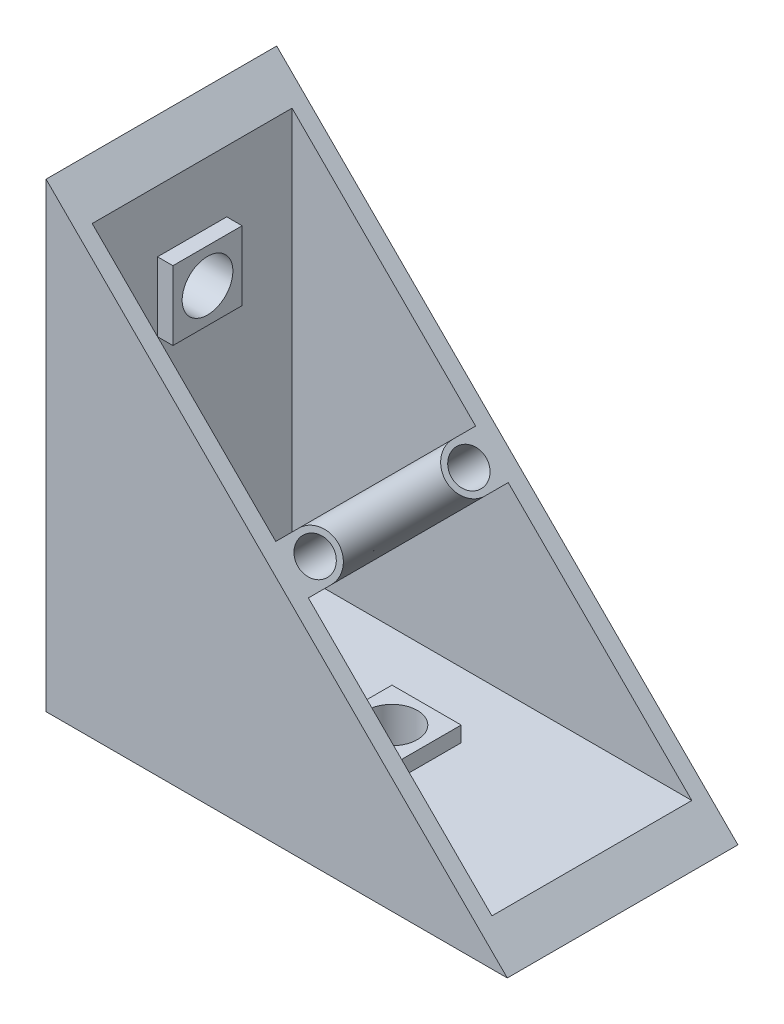
ISO-10303-21;
HEADER;
FILE_DESCRIPTION(('STEP AP214'),'2;1');
FILE_NAME('part.step','',(''),(''),'','','');
FILE_SCHEMA(('AUTOMOTIVE_DESIGN { 1 0 10303 214 1 1 1 1 }'));
ENDSEC;
DATA;
#1=APPLICATION_CONTEXT('core data for automotive mechanical design processes');
#2=APPLICATION_PROTOCOL_DEFINITION('international standard','automotive_design',2000,#1);
#3=PRODUCT_CONTEXT('',#1,'mechanical');
#4=PRODUCT('Part','Part','',(#3));
#5=PRODUCT_RELATED_PRODUCT_CATEGORY('part','',(#4));
#6=PRODUCT_DEFINITION_FORMATION('','',#4);
#7=PRODUCT_DEFINITION_CONTEXT('part definition',#1,'design');
#8=PRODUCT_DEFINITION('design','',#6,#7);
#9=PRODUCT_DEFINITION_SHAPE('','',#8);
#10=(LENGTH_UNIT() NAMED_UNIT(*) SI_UNIT(.MILLI.,.METRE.));
#11=(NAMED_UNIT(*) PLANE_ANGLE_UNIT() SI_UNIT($,.RADIAN.));
#12=(NAMED_UNIT(*) SI_UNIT($,.STERADIAN.) SOLID_ANGLE_UNIT());
#13=UNCERTAINTY_MEASURE_WITH_UNIT(LENGTH_MEASURE(1.E-05),#10,'distance_accuracy_value','');
#14=(GEOMETRIC_REPRESENTATION_CONTEXT(3) GLOBAL_UNCERTAINTY_ASSIGNED_CONTEXT((#13)) GLOBAL_UNIT_ASSIGNED_CONTEXT((#10,
#11,#12)) REPRESENTATION_CONTEXT('',''));
#15=CARTESIAN_POINT('',(0.,0.,0.));
#16=DIRECTION('',(0.,0.,1.));
#17=DIRECTION('',(1.,0.,0.));
#18=AXIS2_PLACEMENT_3D('',#15,#16,#17);
#19=CARTESIAN_POINT('',(4.,0.,-30.));
#20=DIRECTION('',(-1.,0.,0.));
#21=DIRECTION('',(0.,0.,1.));
#22=AXIS2_PLACEMENT_3D('',#19,#20,#21);
#23=PLANE('',#22);
#24=DIRECTION('',(0.,1.,0.));
#25=VECTOR('',#24,1.);
#26=CARTESIAN_POINT('',(4.,48.,-19.5));
#27=LINE('',#26,#25);
#28=CARTESIAN_POINT('',(4.,39.,-19.5));
#29=VERTEX_POINT('',#28);
#30=CARTESIAN_POINT('',(4.,48.,-19.5));
#31=VERTEX_POINT('',#30);
#32=EDGE_CURVE('E273',#29,#31,#27,.T.);
#33=ORIENTED_EDGE('',*,*,#32,.F.);
#34=DIRECTION('',(0.,0.,-1.));
#35=VECTOR('',#34,1.);
#36=CARTESIAN_POINT('',(4.,39.,-10.5));
#37=LINE('',#36,#35);
#38=CARTESIAN_POINT('',(4.,39.,-10.5));
#39=VERTEX_POINT('',#38);
#40=EDGE_CURVE('E278',#39,#29,#37,.T.);
#41=ORIENTED_EDGE('',*,*,#40,.F.);
#42=DIRECTION('',(0.,-1.,0.));
#43=VECTOR('',#42,1.);
#44=CARTESIAN_POINT('',(4.,48.,-10.5));
#45=LINE('',#44,#43);
#46=CARTESIAN_POINT('',(4.,48.,-10.5));
#47=VERTEX_POINT('',#46);
#48=EDGE_CURVE('E290',#47,#39,#45,.T.);
#49=ORIENTED_EDGE('',*,*,#48,.F.);
#50=DIRECTION('',(0.,0.,1.));
#51=VECTOR('',#50,1.);
#52=CARTESIAN_POINT('',(4.,48.,-10.5));
#53=LINE('',#52,#51);
#54=EDGE_CURVE('E287',#31,#47,#53,.T.);
#55=ORIENTED_EDGE('',*,*,#54,.F.);
#56=EDGE_LOOP('',(#33,#41,#49,#55));
#57=FACE_BOUND('',#56,.T.);
#58=DIRECTION('',(0.,-1.,0.));
#59=VECTOR('',#58,1.);
#60=CARTESIAN_POINT('',(4.,0.,-2.));
#61=LINE('',#60,#59);
#62=CARTESIAN_POINT('',(4.,56.,-2.));
#63=VERTEX_POINT('',#62);
#64=CARTESIAN_POINT('',(4.,8.24264068711929,-2.));
#65=VERTEX_POINT('',#64);
#66=EDGE_CURVE('E339',#63,#65,#61,.T.);
#67=ORIENTED_EDGE('',*,*,#66,.T.);
#68=DIRECTION('',(0.,0.,-1.));
#69=VECTOR('',#68,1.);
#70=CARTESIAN_POINT('',(4.,8.24264068711932,-30.));
#71=LINE('',#70,#69);
#72=CARTESIAN_POINT('',(4.,8.24264068711929,-5.));
#73=VERTEX_POINT('',#72);
#74=EDGE_CURVE('E238',#65,#73,#71,.T.);
#75=ORIENTED_EDGE('',*,*,#74,.T.);
#76=CARTESIAN_POINT('',(4.,4.00000000000001,-5.));
#77=DIRECTION('',(-1.,0.,0.));
#78=DIRECTION('',(0.,1.,0.));
#79=AXIS2_PLACEMENT_3D('',#76,#77,#78);
#80=ELLIPSE('',#79,4.24264068711928,3.);
#81=CARTESIAN_POINT('',(4.00000000000001,4.,-8.));
#82=VERTEX_POINT('',#81);
#83=EDGE_CURVE('E267',#73,#82,#80,.T.);
#84=ORIENTED_EDGE('',*,*,#83,.T.);
#85=DIRECTION('',(0.,0.,1.));
#86=VECTOR('',#85,1.);
#87=CARTESIAN_POINT('',(4.,4.,-30.));
#88=LINE('',#87,#86);
#89=CARTESIAN_POINT('',(4.,4.,-22.));
#90=VERTEX_POINT('',#89);
#91=EDGE_CURVE('E349',#90,#82,#88,.T.);
#92=ORIENTED_EDGE('',*,*,#91,.F.);
#93=CARTESIAN_POINT('',(4.,3.99999999999999,-25.));
#94=DIRECTION('',(-1.,0.,0.));
#95=DIRECTION('',(0.,1.,0.));
#96=AXIS2_PLACEMENT_3D('',#93,#94,#95);
#97=ELLIPSE('',#96,4.24264068711928,3.);
#98=CARTESIAN_POINT('',(4.,8.24264068711928,-25.));
#99=VERTEX_POINT('',#98);
#100=EDGE_CURVE('E60',#99,#90,#97,.F.);
#101=ORIENTED_EDGE('',*,*,#100,.F.);
#102=DIRECTION('',(0.,0.,1.));
#103=VECTOR('',#102,1.);
#104=CARTESIAN_POINT('',(4.,8.24264068711926,-30.));
#105=LINE('',#104,#103);
#106=CARTESIAN_POINT('',(4.,8.24264068711927,-28.));
#107=VERTEX_POINT('',#106);
#108=EDGE_CURVE('E261',#107,#99,#105,.T.);
#109=ORIENTED_EDGE('',*,*,#108,.F.);
#110=DIRECTION('',(0.,-1.,0.));
#111=VECTOR('',#110,1.);
#112=CARTESIAN_POINT('',(4.,0.,-28.));
#113=LINE('',#112,#111);
#114=CARTESIAN_POINT('',(4.,56.,-28.));
#115=VERTEX_POINT('',#114);
#116=EDGE_CURVE('E343',#115,#107,#113,.T.);
#117=ORIENTED_EDGE('',*,*,#116,.F.);
#118=DIRECTION('',(0.,0.,1.));
#119=VECTOR('',#118,1.);
#120=CARTESIAN_POINT('',(4.,56.,-30.));
#121=LINE('',#120,#119);
#122=EDGE_CURVE('E356',#115,#63,#121,.T.);
#123=ORIENTED_EDGE('',*,*,#122,.T.);
#124=EDGE_LOOP('',(#67,#75,#84,#92,#101,#109,#117,#123));
#125=FACE_BOUND('',#124,.T.);
#126=ADVANCED_FACE('F45',(#57,#125),#23,.F.);
#127=CARTESIAN_POINT('',(0.,4.,-30.));
#128=DIRECTION('',(0.,-1.,0.));
#129=DIRECTION('',(0.,0.,-1.));
#130=AXIS2_PLACEMENT_3D('',#127,#128,#129);
#131=PLANE('',#130);
#132=DIRECTION('',(0.,0.,-1.));
#133=VECTOR('',#132,1.);
#134=CARTESIAN_POINT('',(34.5,4.,-19.5));
#135=LINE('',#134,#133);
#136=CARTESIAN_POINT('',(34.5,4.,-10.5));
#137=VERTEX_POINT('',#136);
#138=CARTESIAN_POINT('',(34.5,4.,-19.5));
#139=VERTEX_POINT('',#138);
#140=EDGE_CURVE('E306',#137,#139,#135,.T.);
#141=ORIENTED_EDGE('',*,*,#140,.F.);
#142=DIRECTION('',(1.,0.,0.));
#143=VECTOR('',#142,1.);
#144=CARTESIAN_POINT('',(25.5,4.,-10.5));
#145=LINE('',#144,#143);
#146=CARTESIAN_POINT('',(25.5,4.,-10.5));
#147=VERTEX_POINT('',#146);
#148=EDGE_CURVE('E311',#147,#137,#145,.T.);
#149=ORIENTED_EDGE('',*,*,#148,.F.);
#150=DIRECTION('',(0.,0.,1.));
#151=VECTOR('',#150,1.);
#152=CARTESIAN_POINT('',(25.5,4.,-19.5));
#153=LINE('',#152,#151);
#154=CARTESIAN_POINT('',(25.5,4.,-19.5));
#155=VERTEX_POINT('',#154);
#156=EDGE_CURVE('E323',#155,#147,#153,.T.);
#157=ORIENTED_EDGE('',*,*,#156,.F.);
#158=DIRECTION('',(-1.,0.,0.));
#159=VECTOR('',#158,1.);
#160=CARTESIAN_POINT('',(25.5,4.,-19.5));
#161=LINE('',#160,#159);
#162=EDGE_CURVE('E320',#139,#155,#161,.T.);
#163=ORIENTED_EDGE('',*,*,#162,.F.);
#164=EDGE_LOOP('',(#141,#149,#157,#163));
#165=FACE_BOUND('',#164,.T.);
#166=DIRECTION('',(0.,0.,-1.));
#167=VECTOR('',#166,1.);
#168=CARTESIAN_POINT('',(8.24264068711924,4.,-30.));
#169=LINE('',#168,#167);
#170=CARTESIAN_POINT('',(8.24264068711927,4.,-2.));
#171=VERTEX_POINT('',#170);
#172=CARTESIAN_POINT('',(8.24264068711927,4.,-5.));
#173=VERTEX_POINT('',#172);
#174=EDGE_CURVE('E213',#171,#173,#169,.T.);
#175=ORIENTED_EDGE('',*,*,#174,.F.);
#176=DIRECTION('',(1.,0.,0.));
#177=VECTOR('',#176,1.);
#178=CARTESIAN_POINT('',(0.,4.,-2.));
#179=LINE('',#178,#177);
#180=CARTESIAN_POINT('',(56.,4.,-2.));
#181=VERTEX_POINT('',#180);
#182=EDGE_CURVE('E342',#171,#181,#179,.T.);
#183=ORIENTED_EDGE('',*,*,#182,.T.);
#184=DIRECTION('',(0.,0.,1.));
#185=VECTOR('',#184,1.);
#186=CARTESIAN_POINT('',(56.,4.,-30.));
#187=LINE('',#186,#185);
#188=CARTESIAN_POINT('',(56.,4.,-28.));
#189=VERTEX_POINT('',#188);
#190=EDGE_CURVE('E360',#189,#181,#187,.T.);
#191=ORIENTED_EDGE('',*,*,#190,.F.);
#192=DIRECTION('',(1.,0.,0.));
#193=VECTOR('',#192,1.);
#194=CARTESIAN_POINT('',(0.,4.,-28.));
#195=LINE('',#194,#193);
#196=CARTESIAN_POINT('',(8.24264068711929,4.,-28.));
#197=VERTEX_POINT('',#196);
#198=EDGE_CURVE('E346',#197,#189,#195,.T.);
#199=ORIENTED_EDGE('',*,*,#198,.F.);
#200=DIRECTION('',(0.,0.,1.));
#201=VECTOR('',#200,1.);
#202=CARTESIAN_POINT('',(8.24264068711929,4.,-30.));
#203=LINE('',#202,#201);
#204=CARTESIAN_POINT('',(8.24264068711929,4.,-25.));
#205=VERTEX_POINT('',#204);
#206=EDGE_CURVE('E68',#197,#205,#203,.T.);
#207=ORIENTED_EDGE('',*,*,#206,.T.);
#208=CARTESIAN_POINT('',(4.00000000000001,4.,-25.));
#209=DIRECTION('',(0.,-1.,0.));
#210=DIRECTION('',(1.,0.,0.));
#211=AXIS2_PLACEMENT_3D('',#208,#209,#210);
#212=ELLIPSE('',#211,4.24264068711929,3.);
#213=EDGE_CURVE('E400',#90,#205,#212,.F.);
#214=ORIENTED_EDGE('',*,*,#213,.F.);
#215=ORIENTED_EDGE('',*,*,#91,.T.);
#216=CARTESIAN_POINT('',(3.99999999999999,4.,-5.));
#217=DIRECTION('',(0.,-1.,0.));
#218=DIRECTION('',(1.,0.,0.));
#219=AXIS2_PLACEMENT_3D('',#216,#217,#218);
#220=ELLIPSE('',#219,4.24264068711929,3.);
#221=EDGE_CURVE('E53',#82,#173,#220,.T.);
#222=ORIENTED_EDGE('',*,*,#221,.T.);
#223=EDGE_LOOP('',(#175,#183,#191,#199,#207,#214,#215,#222));
#224=FACE_BOUND('',#223,.T.);
#225=ADVANCED_FACE('F402',(#165,#224),#131,.F.);
#226=CARTESIAN_POINT('',(0.,0.,-28.));
#227=DIRECTION('',(0.,0.,-1.));
#228=DIRECTION('',(-1.,0.,0.));
#229=AXIS2_PLACEMENT_3D('',#226,#227,#228);
#230=PLANE('',#229);
#231=DIRECTION('',(-0.707106781186548,-0.707106781186547,0.));
#232=VECTOR('',#231,1.);
#233=CARTESIAN_POINT('',(-2.12132034355964,2.12132034355964,-28.));
#234=LINE('',#233,#232);
#235=CARTESIAN_POINT('',(27.8786796564404,32.1213203435596,-28.));
#236=VERTEX_POINT('',#235);
#237=EDGE_CURVE('E394',#236,#107,#234,.T.);
#238=ORIENTED_EDGE('',*,*,#237,.F.);
#239=DIRECTION('',(-0.707106781186548,0.707106781186548,0.));
#240=VECTOR('',#239,1.);
#241=CARTESIAN_POINT('',(0.,60.,-28.));
#242=LINE('',#241,#240);
#243=EDGE_CURVE('E355',#236,#115,#242,.T.);
#244=ORIENTED_EDGE('',*,*,#243,.T.);
#245=ORIENTED_EDGE('',*,*,#116,.T.);
#246=EDGE_LOOP('',(#238,#244,#245));
#247=FACE_BOUND('',#246,.T.);
#248=ADVANCED_FACE('F415',(#247),#230,.F.);
#249=CARTESIAN_POINT('',(0.,0.,-2.));
#250=DIRECTION('',(0.,0.,-1.));
#251=DIRECTION('',(-1.,0.,0.));
#252=AXIS2_PLACEMENT_3D('',#249,#250,#251);
#253=PLANE('',#252);
#254=ORIENTED_EDGE('',*,*,#182,.F.);
#255=DIRECTION('',(0.707106781186548,0.707106781186547,0.));
#256=VECTOR('',#255,1.);
#257=CARTESIAN_POINT('',(2.12132034355963,-2.12132034355964,-2.));
#258=LINE('',#257,#256);
#259=CARTESIAN_POINT('',(32.1213203435597,27.8786796564404,-2.));
#260=VERTEX_POINT('',#259);
#261=EDGE_CURVE('E390',#171,#260,#258,.T.);
#262=ORIENTED_EDGE('',*,*,#261,.T.);
#263=DIRECTION('',(-0.707106781186548,0.707106781186548,0.));
#264=VECTOR('',#263,1.);
#265=CARTESIAN_POINT('',(0.,60.,-2.));
#266=LINE('',#265,#264);
#267=EDGE_CURVE('E228',#181,#260,#266,.T.);
#268=ORIENTED_EDGE('',*,*,#267,.F.);
#269=EDGE_LOOP('',(#254,#262,#268));
#270=FACE_BOUND('',#269,.T.);
#271=ADVANCED_FACE('F433',(#270),#253,.T.);
#272=CARTESIAN_POINT('',(0.,60.,-30.));
#273=DIRECTION('',(0.707106781186547,0.707106781186547,0.));
#274=DIRECTION('',(-0.707106781186548,0.707106781186548,0.));
#275=AXIS2_PLACEMENT_3D('',#272,#273,#274);
#276=PLANE('',#275);
#277=DIRECTION('',(-0.707106781186547,0.707106781186547,0.));
#278=VECTOR('',#277,1.);
#279=CARTESIAN_POINT('',(0.,60.,0.));
#280=LINE('',#279,#278);
#281=CARTESIAN_POINT('',(60.,0.,0.));
#282=VERTEX_POINT('',#281);
#283=CARTESIAN_POINT('',(0.,60.,0.));
#284=VERTEX_POINT('',#283);
#285=EDGE_CURVE('E368',#282,#284,#280,.T.);
#286=ORIENTED_EDGE('',*,*,#285,.F.);
#287=DIRECTION('',(0.,0.,1.));
#288=VECTOR('',#287,1.);
#289=CARTESIAN_POINT('',(60.,0.,-30.));
#290=LINE('',#289,#288);
#291=CARTESIAN_POINT('',(60.,0.,-30.));
#292=VERTEX_POINT('',#291);
#293=EDGE_CURVE('E385',#292,#282,#290,.T.);
#294=ORIENTED_EDGE('',*,*,#293,.F.);
#295=DIRECTION('',(-0.707106781186547,0.707106781186547,0.));
#296=VECTOR('',#295,1.);
#297=CARTESIAN_POINT('',(0.,60.,-30.));
#298=LINE('',#297,#296);
#299=CARTESIAN_POINT('',(0.,60.,-30.));
#300=VERTEX_POINT('',#299);
#301=EDGE_CURVE('E371',#292,#300,#298,.T.);
#302=ORIENTED_EDGE('',*,*,#301,.T.);
#303=DIRECTION('',(0.,0.,1.));
#304=VECTOR('',#303,1.);
#305=CARTESIAN_POINT('',(0.,60.,-30.));
#306=LINE('',#305,#304);
#307=EDGE_CURVE('E382',#300,#284,#306,.T.);
#308=ORIENTED_EDGE('',*,*,#307,.T.);
#309=EDGE_LOOP('',(#286,#294,#302,#308));
#310=FACE_BOUND('',#309,.T.);
#311=ORIENTED_EDGE('',*,*,#190,.T.);
#312=ORIENTED_EDGE('',*,*,#267,.T.);
#313=DIRECTION('',(0.,0.,1.));
#314=VECTOR('',#313,1.);
#315=CARTESIAN_POINT('',(32.1213203435597,27.8786796564404,0.));
#316=LINE('',#315,#314);
#317=CARTESIAN_POINT('',(32.1213203435597,27.8786796564404,-5.));
#318=VERTEX_POINT('',#317);
#319=EDGE_CURVE('E210',#318,#260,#316,.T.);
#320=ORIENTED_EDGE('',*,*,#319,.F.);
#321=CARTESIAN_POINT('',(30.,30.,-5.));
#322=DIRECTION('',(0.707106781186548,0.707106781186547,0.));
#323=DIRECTION('',(-0.707106781186547,0.707106781186548,0.));
#324=AXIS2_PLACEMENT_3D('',#321,#322,#323);
#325=CIRCLE('',#324,3.);
#326=CARTESIAN_POINT('',(27.8786796564404,32.1213203435597,-5.));
#327=VERTEX_POINT('',#326);
#328=EDGE_CURVE('E226',#318,#327,#325,.T.);
#329=ORIENTED_EDGE('',*,*,#328,.T.);
#330=DIRECTION('',(0.,0.,1.));
#331=VECTOR('',#330,1.);
#332=CARTESIAN_POINT('',(27.8786796564404,32.1213203435597,0.));
#333=LINE('',#332,#331);
#334=CARTESIAN_POINT('',(27.8786796564404,32.1213203435596,-2.));
#335=VERTEX_POINT('',#334);
#336=EDGE_CURVE('E218',#327,#335,#333,.T.);
#337=ORIENTED_EDGE('',*,*,#336,.T.);
#338=EDGE_CURVE('E353',#335,#63,#266,.T.);
#339=ORIENTED_EDGE('',*,*,#338,.T.);
#340=ORIENTED_EDGE('',*,*,#122,.F.);
#341=ORIENTED_EDGE('',*,*,#243,.F.);
#342=DIRECTION('',(0.,0.,-1.));
#343=VECTOR('',#342,1.);
#344=CARTESIAN_POINT('',(27.8786796564404,32.1213203435597,0.));
#345=LINE('',#344,#343);
#346=CARTESIAN_POINT('',(27.8786796564404,32.1213203435596,-25.));
#347=VERTEX_POINT('',#346);
#348=EDGE_CURVE('E247',#347,#236,#345,.T.);
#349=ORIENTED_EDGE('',*,*,#348,.F.);
#350=CARTESIAN_POINT('',(30.,30.,-25.));
#351=DIRECTION('',(0.707106781186548,0.707106781186547,0.));
#352=DIRECTION('',(-0.707106781186547,0.707106781186548,0.));
#353=AXIS2_PLACEMENT_3D('',#350,#351,#352);
#354=CIRCLE('',#353,3.);
#355=CARTESIAN_POINT('',(32.1213203435597,27.8786796564404,-25.));
#356=VERTEX_POINT('',#355);
#357=EDGE_CURVE('E240',#356,#347,#354,.F.);
#358=ORIENTED_EDGE('',*,*,#357,.F.);
#359=DIRECTION('',(0.,0.,-1.));
#360=VECTOR('',#359,1.);
#361=CARTESIAN_POINT('',(32.1213203435596,27.8786796564404,0.));
#362=LINE('',#361,#360);
#363=CARTESIAN_POINT('',(32.1213203435596,27.8786796564404,-28.));
#364=VERTEX_POINT('',#363);
#365=EDGE_CURVE('E243',#356,#364,#362,.T.);
#366=ORIENTED_EDGE('',*,*,#365,.T.);
#367=EDGE_CURVE('E350',#189,#364,#242,.T.);
#368=ORIENTED_EDGE('',*,*,#367,.F.);
#369=EDGE_LOOP('',(#311,#312,#320,#329,#337,#339,#340,#341,#349,#358,#366,#368));
#370=FACE_BOUND('',#369,.T.);
#371=CARTESIAN_POINT('',(30.,30.,-5.));
#372=DIRECTION('',(0.707106781186548,0.707106781186547,0.));
#373=DIRECTION('',(-0.707106781186547,0.707106781186548,0.));
#374=AXIS2_PLACEMENT_3D('',#371,#372,#373);
#375=CIRCLE('',#374,2.25);
#376=CARTESIAN_POINT('',(28.4090097423303,31.5909902576698,-5.));
#377=VERTEX_POINT('',#376);
#378=EDGE_CURVE('E229',#377,#377,#375,.T.);
#379=ORIENTED_EDGE('',*,*,#378,.F.);
#380=EDGE_LOOP('',(#379));
#381=FACE_BOUND('',#380,.T.);
#382=CARTESIAN_POINT('',(30.,30.,-25.));
#383=DIRECTION('',(0.707106781186548,0.707106781186547,0.));
#384=DIRECTION('',(-0.707106781186547,0.707106781186548,0.));
#385=AXIS2_PLACEMENT_3D('',#382,#383,#384);
#386=CIRCLE('',#385,2.25);
#387=CARTESIAN_POINT('',(28.4090097423303,31.5909902576697,-25.));
#388=VERTEX_POINT('',#387);
#389=EDGE_CURVE('E250',#388,#388,#386,.F.);
#390=ORIENTED_EDGE('',*,*,#389,.T.);
#391=EDGE_LOOP('',(#390));
#392=FACE_BOUND('',#391,.T.);
#393=ADVANCED_FACE('F224',(#310,#370,#381,#392),#276,.T.);
#394=CARTESIAN_POINT('',(0.,0.,-30.));
#395=DIRECTION('',(-1.,0.,0.));
#396=DIRECTION('',(0.,0.,1.));
#397=AXIS2_PLACEMENT_3D('',#394,#395,#396);
#398=PLANE('',#397);
#399=CARTESIAN_POINT('',(0.,43.5,-15.));
#400=DIRECTION('',(1.,0.,0.));
#401=DIRECTION('',(0.,0.,-1.));
#402=AXIS2_PLACEMENT_3D('',#399,#400,#401);
#403=CIRCLE('',#402,3.3);
#404=CARTESIAN_POINT('',(0.,43.5,-18.3));
#405=VERTEX_POINT('',#404);
#406=EDGE_CURVE('E709',#405,#405,#403,.T.);
#407=ORIENTED_EDGE('',*,*,#406,.T.);
#408=EDGE_LOOP('',(#407));
#409=FACE_BOUND('',#408,.T.);
#410=DIRECTION('',(0.,-1.,0.));
#411=VECTOR('',#410,1.);
#412=CARTESIAN_POINT('',(0.,0.,0.));
#413=LINE('',#412,#411);
#414=CARTESIAN_POINT('',(0.,0.,0.));
#415=VERTEX_POINT('',#414);
#416=EDGE_CURVE('E359',#284,#415,#413,.T.);
#417=ORIENTED_EDGE('',*,*,#416,.F.);
#418=ORIENTED_EDGE('',*,*,#307,.F.);
#419=DIRECTION('',(0.,-1.,0.));
#420=VECTOR('',#419,1.);
#421=CARTESIAN_POINT('',(0.,0.,-30.));
#422=LINE('',#421,#420);
#423=CARTESIAN_POINT('',(0.,0.,-30.));
#424=VERTEX_POINT('',#423);
#425=EDGE_CURVE('E364',#300,#424,#422,.T.);
#426=ORIENTED_EDGE('',*,*,#425,.T.);
#427=DIRECTION('',(0.,0.,1.));
#428=VECTOR('',#427,1.);
#429=CARTESIAN_POINT('',(0.,0.,-30.));
#430=LINE('',#429,#428);
#431=EDGE_CURVE('E374',#424,#415,#430,.T.);
#432=ORIENTED_EDGE('',*,*,#431,.T.);
#433=EDGE_LOOP('',(#417,#418,#426,#432));
#434=FACE_BOUND('',#433,.T.);
#435=ADVANCED_FACE('F47',(#409,#434),#398,.T.);
#436=CARTESIAN_POINT('',(0.,0.,-30.));
#437=DIRECTION('',(0.,-1.,0.));
#438=DIRECTION('',(0.,0.,-1.));
#439=AXIS2_PLACEMENT_3D('',#436,#437,#438);
#440=PLANE('',#439);
#441=CARTESIAN_POINT('',(30.,0.,-15.));
#442=DIRECTION('',(0.,1.,0.));
#443=DIRECTION('',(0.,0.,1.));
#444=AXIS2_PLACEMENT_3D('',#441,#442,#443);
#445=CIRCLE('',#444,3.3);
#446=CARTESIAN_POINT('',(30.,0.,-11.7));
#447=VERTEX_POINT('',#446);
#448=EDGE_CURVE('E244',#447,#447,#445,.T.);
#449=ORIENTED_EDGE('',*,*,#448,.T.);
#450=EDGE_LOOP('',(#449));
#451=FACE_BOUND('',#450,.T.);
#452=DIRECTION('',(1.,0.,0.));
#453=VECTOR('',#452,1.);
#454=CARTESIAN_POINT('',(0.,0.,0.));
#455=LINE('',#454,#453);
#456=EDGE_CURVE('E377',#415,#282,#455,.T.);
#457=ORIENTED_EDGE('',*,*,#456,.F.);
#458=ORIENTED_EDGE('',*,*,#431,.F.);
#459=DIRECTION('',(1.,0.,0.));
#460=VECTOR('',#459,1.);
#461=CARTESIAN_POINT('',(0.,0.,-30.));
#462=LINE('',#461,#460);
#463=EDGE_CURVE('E367',#424,#292,#462,.T.);
#464=ORIENTED_EDGE('',*,*,#463,.T.);
#465=ORIENTED_EDGE('',*,*,#293,.T.);
#466=EDGE_LOOP('',(#457,#458,#464,#465));
#467=FACE_BOUND('',#466,.T.);
#468=ADVANCED_FACE('F734',(#451,#467),#440,.T.);
#469=CARTESIAN_POINT('',(0.,0.,-30.));
#470=DIRECTION('',(0.,0.,-1.));
#471=DIRECTION('',(-1.,0.,0.));
#472=AXIS2_PLACEMENT_3D('',#469,#470,#471);
#473=PLANE('',#472);
#474=ORIENTED_EDGE('',*,*,#425,.F.);
#475=ORIENTED_EDGE('',*,*,#301,.F.);
#476=ORIENTED_EDGE('',*,*,#463,.F.);
#477=EDGE_LOOP('',(#474,#475,#476));
#478=FACE_BOUND('',#477,.T.);
#479=ADVANCED_FACE('F731',(#478),#473,.T.);
#480=CARTESIAN_POINT('',(0.,0.,0.));
#481=DIRECTION('',(0.,0.,-1.));
#482=DIRECTION('',(-1.,0.,0.));
#483=AXIS2_PLACEMENT_3D('',#480,#481,#482);
#484=PLANE('',#483);
#485=ORIENTED_EDGE('',*,*,#416,.T.);
#486=ORIENTED_EDGE('',*,*,#456,.T.);
#487=ORIENTED_EDGE('',*,*,#285,.T.);
#488=EDGE_LOOP('',(#485,#486,#487));
#489=FACE_BOUND('',#488,.T.);
#490=ADVANCED_FACE('F550',(#489),#484,.F.);
#491=ORIENTED_EDGE('',*,*,#367,.T.);
#492=DIRECTION('',(-0.707106781186548,-0.707106781186547,0.));
#493=VECTOR('',#492,1.);
#494=CARTESIAN_POINT('',(2.12132034355965,-2.12132034355965,-28.));
#495=LINE('',#494,#493);
#496=EDGE_CURVE('E392',#364,#197,#495,.T.);
#497=ORIENTED_EDGE('',*,*,#496,.T.);
#498=ORIENTED_EDGE('',*,*,#198,.T.);
#499=EDGE_LOOP('',(#491,#497,#498));
#500=FACE_BOUND('',#499,.T.);
#501=ADVANCED_FACE('F431',(#500),#230,.F.);
#502=DIRECTION('',(0.707106781186548,0.707106781186547,0.));
#503=VECTOR('',#502,1.);
#504=CARTESIAN_POINT('',(-2.12132034355965,2.12132034355965,-2.));
#505=LINE('',#504,#503);
#506=EDGE_CURVE('E384',#65,#335,#505,.T.);
#507=ORIENTED_EDGE('',*,*,#506,.F.);
#508=ORIENTED_EDGE('',*,*,#66,.F.);
#509=ORIENTED_EDGE('',*,*,#338,.F.);
#510=EDGE_LOOP('',(#507,#508,#509));
#511=FACE_BOUND('',#510,.T.);
#512=ADVANCED_FACE('F410',(#511),#253,.T.);
#513=CARTESIAN_POINT('',(34.5,6.,-19.5));
#514=DIRECTION('',(-1.,0.,0.));
#515=DIRECTION('',(0.,0.,1.));
#516=AXIS2_PLACEMENT_3D('',#513,#514,#515);
#517=PLANE('',#516);
#518=ORIENTED_EDGE('',*,*,#140,.T.);
#519=DIRECTION('',(0.,-1.,0.));
#520=VECTOR('',#519,1.);
#521=CARTESIAN_POINT('',(34.5,6.,-19.5));
#522=LINE('',#521,#520);
#523=CARTESIAN_POINT('',(34.5,6.,-19.5));
#524=VERTEX_POINT('',#523);
#525=EDGE_CURVE('E336',#524,#139,#522,.T.);
#526=ORIENTED_EDGE('',*,*,#525,.F.);
#527=DIRECTION('',(0.,0.,-1.));
#528=VECTOR('',#527,1.);
#529=CARTESIAN_POINT('',(34.5,6.,-19.5));
#530=LINE('',#529,#528);
#531=CARTESIAN_POINT('',(34.5,6.,-10.5));
#532=VERTEX_POINT('',#531);
#533=EDGE_CURVE('E307',#532,#524,#530,.T.);
#534=ORIENTED_EDGE('',*,*,#533,.F.);
#535=DIRECTION('',(0.,-1.,0.));
#536=VECTOR('',#535,1.);
#537=CARTESIAN_POINT('',(34.5,6.,-10.5));
#538=LINE('',#537,#536);
#539=EDGE_CURVE('E317',#532,#137,#538,.T.);
#540=ORIENTED_EDGE('',*,*,#539,.T.);
#541=EDGE_LOOP('',(#518,#526,#534,#540));
#542=FACE_BOUND('',#541,.T.);
#543=ADVANCED_FACE('F445',(#542),#517,.F.);
#544=CARTESIAN_POINT('',(25.5,6.,-19.5));
#545=DIRECTION('',(0.,0.,1.));
#546=DIRECTION('',(1.,0.,0.));
#547=AXIS2_PLACEMENT_3D('',#544,#545,#546);
#548=PLANE('',#547);
#549=ORIENTED_EDGE('',*,*,#162,.T.);
#550=DIRECTION('',(0.,-1.,0.));
#551=VECTOR('',#550,1.);
#552=CARTESIAN_POINT('',(25.5,6.,-19.5));
#553=LINE('',#552,#551);
#554=CARTESIAN_POINT('',(25.5,6.,-19.5));
#555=VERTEX_POINT('',#554);
#556=EDGE_CURVE('E333',#555,#155,#553,.T.);
#557=ORIENTED_EDGE('',*,*,#556,.F.);
#558=DIRECTION('',(-1.,0.,0.));
#559=VECTOR('',#558,1.);
#560=CARTESIAN_POINT('',(25.5,6.,-19.5));
#561=LINE('',#560,#559);
#562=EDGE_CURVE('E310',#524,#555,#561,.T.);
#563=ORIENTED_EDGE('',*,*,#562,.F.);
#564=ORIENTED_EDGE('',*,*,#525,.T.);
#565=EDGE_LOOP('',(#549,#557,#563,#564));
#566=FACE_BOUND('',#565,.T.);
#567=ADVANCED_FACE('F528',(#566),#548,.F.);
#568=CARTESIAN_POINT('',(25.5,6.,-19.5));
#569=DIRECTION('',(1.,0.,0.));
#570=DIRECTION('',(0.,0.,-1.));
#571=AXIS2_PLACEMENT_3D('',#568,#569,#570);
#572=PLANE('',#571);
#573=ORIENTED_EDGE('',*,*,#156,.T.);
#574=DIRECTION('',(0.,-1.,0.));
#575=VECTOR('',#574,1.);
#576=CARTESIAN_POINT('',(25.5,6.,-10.5));
#577=LINE('',#576,#575);
#578=CARTESIAN_POINT('',(25.5,6.,-10.5));
#579=VERTEX_POINT('',#578);
#580=EDGE_CURVE('E330',#579,#147,#577,.T.);
#581=ORIENTED_EDGE('',*,*,#580,.F.);
#582=DIRECTION('',(0.,0.,1.));
#583=VECTOR('',#582,1.);
#584=CARTESIAN_POINT('',(25.5,6.,-19.5));
#585=LINE('',#584,#583);
#586=EDGE_CURVE('E313',#555,#579,#585,.T.);
#587=ORIENTED_EDGE('',*,*,#586,.F.);
#588=ORIENTED_EDGE('',*,*,#556,.T.);
#589=EDGE_LOOP('',(#573,#581,#587,#588));
#590=FACE_BOUND('',#589,.T.);
#591=ADVANCED_FACE('F524',(#590),#572,.F.);
#592=CARTESIAN_POINT('',(25.5,6.,-10.5));
#593=DIRECTION('',(0.,0.,-1.));
#594=DIRECTION('',(-1.,0.,0.));
#595=AXIS2_PLACEMENT_3D('',#592,#593,#594);
#596=PLANE('',#595);
#597=ORIENTED_EDGE('',*,*,#148,.T.);
#598=ORIENTED_EDGE('',*,*,#539,.F.);
#599=DIRECTION('',(1.,0.,0.));
#600=VECTOR('',#599,1.);
#601=CARTESIAN_POINT('',(25.5,6.,-10.5));
#602=LINE('',#601,#600);
#603=EDGE_CURVE('E315',#579,#532,#602,.T.);
#604=ORIENTED_EDGE('',*,*,#603,.F.);
#605=ORIENTED_EDGE('',*,*,#580,.T.);
#606=EDGE_LOOP('',(#597,#598,#604,#605));
#607=FACE_BOUND('',#606,.T.);
#608=ADVANCED_FACE('F520',(#607),#596,.F.);
#609=CARTESIAN_POINT('',(0.,6.,0.));
#610=DIRECTION('',(0.,1.,0.));
#611=DIRECTION('',(0.,0.,1.));
#612=AXIS2_PLACEMENT_3D('',#609,#610,#611);
#613=PLANE('',#612);
#614=CARTESIAN_POINT('',(30.,6.,-15.));
#615=DIRECTION('',(0.,1.,0.));
#616=DIRECTION('',(0.,0.,1.));
#617=AXIS2_PLACEMENT_3D('',#614,#615,#616);
#618=CIRCLE('',#617,3.3);
#619=CARTESIAN_POINT('',(30.,6.,-11.7));
#620=VERTEX_POINT('',#619);
#621=EDGE_CURVE('E714',#620,#620,#618,.T.);
#622=ORIENTED_EDGE('',*,*,#621,.F.);
#623=EDGE_LOOP('',(#622));
#624=FACE_BOUND('',#623,.T.);
#625=ORIENTED_EDGE('',*,*,#533,.T.);
#626=ORIENTED_EDGE('',*,*,#562,.T.);
#627=ORIENTED_EDGE('',*,*,#586,.T.);
#628=ORIENTED_EDGE('',*,*,#603,.T.);
#629=EDGE_LOOP('',(#625,#626,#627,#628));
#630=FACE_BOUND('',#629,.T.);
#631=ADVANCED_FACE('F516',(#624,#630),#613,.T.);
#632=CARTESIAN_POINT('',(6.,48.,-19.5));
#633=DIRECTION('',(0.,0.,1.));
#634=DIRECTION('',(1.,0.,0.));
#635=AXIS2_PLACEMENT_3D('',#632,#633,#634);
#636=PLANE('',#635);
#637=ORIENTED_EDGE('',*,*,#32,.T.);
#638=DIRECTION('',(-1.,0.,0.));
#639=VECTOR('',#638,1.);
#640=CARTESIAN_POINT('',(6.,48.,-19.5));
#641=LINE('',#640,#639);
#642=CARTESIAN_POINT('',(6.,48.,-19.5));
#643=VERTEX_POINT('',#642);
#644=EDGE_CURVE('E303',#643,#31,#641,.T.);
#645=ORIENTED_EDGE('',*,*,#644,.F.);
#646=DIRECTION('',(0.,1.,0.));
#647=VECTOR('',#646,1.);
#648=CARTESIAN_POINT('',(6.,48.,-19.5));
#649=LINE('',#648,#647);
#650=CARTESIAN_POINT('',(6.,39.,-19.5));
#651=VERTEX_POINT('',#650);
#652=EDGE_CURVE('E274',#651,#643,#649,.T.);
#653=ORIENTED_EDGE('',*,*,#652,.F.);
#654=DIRECTION('',(-1.,0.,0.));
#655=VECTOR('',#654,1.);
#656=CARTESIAN_POINT('',(6.,39.,-19.5));
#657=LINE('',#656,#655);
#658=EDGE_CURVE('E284',#651,#29,#657,.T.);
#659=ORIENTED_EDGE('',*,*,#658,.T.);
#660=EDGE_LOOP('',(#637,#645,#653,#659));
#661=FACE_BOUND('',#660,.T.);
#662=ADVANCED_FACE('F512',(#661),#636,.F.);
#663=CARTESIAN_POINT('',(6.,48.,-10.5));
#664=DIRECTION('',(0.,-1.,0.));
#665=DIRECTION('',(0.,0.,-1.));
#666=AXIS2_PLACEMENT_3D('',#663,#664,#665);
#667=PLANE('',#666);
#668=ORIENTED_EDGE('',*,*,#54,.T.);
#669=DIRECTION('',(-1.,0.,0.));
#670=VECTOR('',#669,1.);
#671=CARTESIAN_POINT('',(6.,48.,-10.5));
#672=LINE('',#671,#670);
#673=CARTESIAN_POINT('',(6.,48.,-10.5));
#674=VERTEX_POINT('',#673);
#675=EDGE_CURVE('E300',#674,#47,#672,.T.);
#676=ORIENTED_EDGE('',*,*,#675,.F.);
#677=DIRECTION('',(0.,0.,1.));
#678=VECTOR('',#677,1.);
#679=CARTESIAN_POINT('',(6.,48.,-10.5));
#680=LINE('',#679,#678);
#681=EDGE_CURVE('E277',#643,#674,#680,.T.);
#682=ORIENTED_EDGE('',*,*,#681,.F.);
#683=ORIENTED_EDGE('',*,*,#644,.T.);
#684=EDGE_LOOP('',(#668,#676,#682,#683));
#685=FACE_BOUND('',#684,.T.);
#686=ADVANCED_FACE('F508',(#685),#667,.F.);
#687=CARTESIAN_POINT('',(6.,48.,-10.5));
#688=DIRECTION('',(0.,0.,-1.));
#689=DIRECTION('',(-1.,0.,0.));
#690=AXIS2_PLACEMENT_3D('',#687,#688,#689);
#691=PLANE('',#690);
#692=ORIENTED_EDGE('',*,*,#48,.T.);
#693=DIRECTION('',(-1.,0.,0.));
#694=VECTOR('',#693,1.);
#695=CARTESIAN_POINT('',(6.,39.,-10.5));
#696=LINE('',#695,#694);
#697=CARTESIAN_POINT('',(6.,39.,-10.5));
#698=VERTEX_POINT('',#697);
#699=EDGE_CURVE('E297',#698,#39,#696,.T.);
#700=ORIENTED_EDGE('',*,*,#699,.F.);
#701=DIRECTION('',(0.,-1.,0.));
#702=VECTOR('',#701,1.);
#703=CARTESIAN_POINT('',(6.,48.,-10.5));
#704=LINE('',#703,#702);
#705=EDGE_CURVE('E280',#674,#698,#704,.T.);
#706=ORIENTED_EDGE('',*,*,#705,.F.);
#707=ORIENTED_EDGE('',*,*,#675,.T.);
#708=EDGE_LOOP('',(#692,#700,#706,#707));
#709=FACE_BOUND('',#708,.T.);
#710=ADVANCED_FACE('F504',(#709),#691,.F.);
#711=CARTESIAN_POINT('',(6.,39.,-10.5));
#712=DIRECTION('',(0.,1.,0.));
#713=DIRECTION('',(0.,0.,1.));
#714=AXIS2_PLACEMENT_3D('',#711,#712,#713);
#715=PLANE('',#714);
#716=ORIENTED_EDGE('',*,*,#40,.T.);
#717=ORIENTED_EDGE('',*,*,#658,.F.);
#718=DIRECTION('',(0.,0.,-1.));
#719=VECTOR('',#718,1.);
#720=CARTESIAN_POINT('',(6.,39.,-10.5));
#721=LINE('',#720,#719);
#722=EDGE_CURVE('E282',#698,#651,#721,.T.);
#723=ORIENTED_EDGE('',*,*,#722,.F.);
#724=ORIENTED_EDGE('',*,*,#699,.T.);
#725=EDGE_LOOP('',(#716,#717,#723,#724));
#726=FACE_BOUND('',#725,.T.);
#727=ADVANCED_FACE('F487',(#726),#715,.F.);
#728=CARTESIAN_POINT('',(6.,0.,0.));
#729=DIRECTION('',(1.,0.,0.));
#730=DIRECTION('',(0.,0.,-1.));
#731=AXIS2_PLACEMENT_3D('',#728,#729,#730);
#732=PLANE('',#731);
#733=CARTESIAN_POINT('',(6.,43.5,-15.));
#734=DIRECTION('',(1.,0.,0.));
#735=DIRECTION('',(0.,0.,-1.));
#736=AXIS2_PLACEMENT_3D('',#733,#734,#735);
#737=CIRCLE('',#736,3.29999999999999);
#738=CARTESIAN_POINT('',(6.,43.5,-18.3));
#739=VERTEX_POINT('',#738);
#740=EDGE_CURVE('E712',#739,#739,#737,.T.);
#741=ORIENTED_EDGE('',*,*,#740,.F.);
#742=EDGE_LOOP('',(#741));
#743=FACE_BOUND('',#742,.T.);
#744=ORIENTED_EDGE('',*,*,#652,.T.);
#745=ORIENTED_EDGE('',*,*,#681,.T.);
#746=ORIENTED_EDGE('',*,*,#705,.T.);
#747=ORIENTED_EDGE('',*,*,#722,.T.);
#748=EDGE_LOOP('',(#744,#745,#746,#747));
#749=FACE_BOUND('',#748,.T.);
#750=ADVANCED_FACE('F479',(#743,#749),#732,.T.);
#751=CARTESIAN_POINT('',(4.,4.00000000000002,-5.));
#752=DIRECTION('',(0.707106781186548,0.707106781186547,0.));
#753=DIRECTION('',(-0.707106781186547,0.707106781186548,0.));
#754=AXIS2_PLACEMENT_3D('',#751,#752,#753);
#755=CYLINDRICAL_SURFACE('',#754,2.25);
#756=ORIENTED_EDGE('',*,*,#378,.T.);
#757=EDGE_LOOP('',(#756));
#758=FACE_BOUND('',#757,.T.);
#759=CARTESIAN_POINT('',(3.99999999999999,4.,-5.));
#760=DIRECTION('',(0.,-1.,0.));
#761=DIRECTION('',(1.,0.,0.));
#762=AXIS2_PLACEMENT_3D('',#759,#760,#761);
#763=ELLIPSE('',#762,3.18198051533946,2.25);
#764=CARTESIAN_POINT('',(4.,4.,-7.25));
#765=VERTEX_POINT('',#764);
#766=CARTESIAN_POINT('',(4.00000000000002,4.,-2.75));
#767=VERTEX_POINT('',#766);
#768=EDGE_CURVE('E11',#765,#767,#763,.T.);
#769=ORIENTED_EDGE('',*,*,#768,.T.);
#770=CARTESIAN_POINT('',(4.,4.00000000000001,-5.));
#771=DIRECTION('',(-1.,0.,0.));
#772=DIRECTION('',(0.,1.,0.));
#773=AXIS2_PLACEMENT_3D('',#770,#771,#772);
#774=ELLIPSE('',#773,3.18198051533946,2.25);
#775=EDGE_CURVE('E270',#767,#765,#774,.T.);
#776=ORIENTED_EDGE('',*,*,#775,.T.);
#777=EDGE_LOOP('',(#769,#776));
#778=FACE_BOUND('',#777,.T.);
#779=ADVANCED_FACE('F477',(#758,#778),#755,.F.);
#780=CARTESIAN_POINT('',(4.,4.00000000000001,-5.));
#781=DIRECTION('',(0.707106781186548,0.707106781186547,0.));
#782=DIRECTION('',(-0.707106781186547,0.707106781186548,0.));
#783=AXIS2_PLACEMENT_3D('',#780,#781,#782);
#784=CYLINDRICAL_SURFACE('',#783,3.);
#785=ORIENTED_EDGE('',*,*,#83,.F.);
#786=DIRECTION('',(0.707106781186548,0.707106781186547,0.));
#787=VECTOR('',#786,1.);
#788=CARTESIAN_POINT('',(1.87867965644036,6.12132034355965,-5.));
#789=LINE('',#788,#787);
#790=EDGE_CURVE('E217',#73,#327,#789,.T.);
#791=ORIENTED_EDGE('',*,*,#790,.T.);
#792=ORIENTED_EDGE('',*,*,#328,.F.);
#793=DIRECTION('',(0.707106781186548,0.707106781186547,0.));
#794=VECTOR('',#793,1.);
#795=CARTESIAN_POINT('',(6.12132034355964,1.87867965644037,-5.));
#796=LINE('',#795,#794);
#797=EDGE_CURVE('E207',#173,#318,#796,.T.);
#798=ORIENTED_EDGE('',*,*,#797,.F.);
#799=ORIENTED_EDGE('',*,*,#221,.F.);
#800=EDGE_LOOP('',(#785,#791,#792,#798,#799));
#801=FACE_BOUND('',#800,.T.);
#802=ADVANCED_FACE('F231',(#801),#784,.T.);
#803=CARTESIAN_POINT('',(6.12132034355964,1.87867965644037,0.));
#804=DIRECTION('',(-0.707106781186547,0.707106781186548,0.));
#805=DIRECTION('',(-0.707106781186548,-0.707106781186547,0.));
#806=AXIS2_PLACEMENT_3D('',#803,#804,#805);
#807=PLANE('',#806);
#808=ORIENTED_EDGE('',*,*,#261,.F.);
#809=ORIENTED_EDGE('',*,*,#174,.T.);
#810=ORIENTED_EDGE('',*,*,#797,.T.);
#811=ORIENTED_EDGE('',*,*,#319,.T.);
#812=EDGE_LOOP('',(#808,#809,#810,#811));
#813=FACE_BOUND('',#812,.T.);
#814=ADVANCED_FACE('F209',(#813),#807,.F.);
#815=CARTESIAN_POINT('',(1.87867965644036,6.12132034355965,0.));
#816=DIRECTION('',(-0.707106781186547,0.707106781186548,0.));
#817=DIRECTION('',(-0.707106781186548,-0.707106781186547,0.));
#818=AXIS2_PLACEMENT_3D('',#815,#816,#817);
#819=PLANE('',#818);
#820=ORIENTED_EDGE('',*,*,#74,.F.);
#821=ORIENTED_EDGE('',*,*,#506,.T.);
#822=ORIENTED_EDGE('',*,*,#336,.F.);
#823=ORIENTED_EDGE('',*,*,#790,.F.);
#824=EDGE_LOOP('',(#820,#821,#822,#823));
#825=FACE_BOUND('',#824,.T.);
#826=ADVANCED_FACE('F407',(#825),#819,.T.);
#827=CARTESIAN_POINT('',(4.00000000000001,4.,-25.));
#828=DIRECTION('',(0.707106781186548,0.707106781186547,0.));
#829=DIRECTION('',(-0.707106781186547,0.707106781186548,0.));
#830=AXIS2_PLACEMENT_3D('',#827,#828,#829);
#831=CYLINDRICAL_SURFACE('',#830,3.);
#832=DIRECTION('',(0.707106781186548,0.707106781186547,0.));
#833=VECTOR('',#832,1.);
#834=CARTESIAN_POINT('',(1.87867965644036,6.12132034355965,-25.));
#835=LINE('',#834,#833);
#836=EDGE_CURVE('E254',#99,#347,#835,.T.);
#837=ORIENTED_EDGE('',*,*,#836,.F.);
#838=ORIENTED_EDGE('',*,*,#100,.T.);
#839=ORIENTED_EDGE('',*,*,#213,.T.);
#840=DIRECTION('',(0.707106781186548,0.707106781186547,0.));
#841=VECTOR('',#840,1.);
#842=CARTESIAN_POINT('',(6.12132034355965,1.87867965644036,-25.));
#843=LINE('',#842,#841);
#844=EDGE_CURVE('E253',#205,#356,#843,.T.);
#845=ORIENTED_EDGE('',*,*,#844,.T.);
#846=ORIENTED_EDGE('',*,*,#357,.T.);
#847=EDGE_LOOP('',(#837,#838,#839,#845,#846));
#848=FACE_BOUND('',#847,.T.);
#849=ADVANCED_FACE('F423',(#848),#831,.T.);
#850=CARTESIAN_POINT('',(4.00000000000001,4.,-25.));
#851=DIRECTION('',(0.707106781186548,0.707106781186547,0.));
#852=DIRECTION('',(-0.707106781186547,0.707106781186548,0.));
#853=AXIS2_PLACEMENT_3D('',#850,#851,#852);
#854=CYLINDRICAL_SURFACE('',#853,2.25);
#855=ORIENTED_EDGE('',*,*,#389,.F.);
#856=EDGE_LOOP('',(#855));
#857=FACE_BOUND('',#856,.T.);
#858=CARTESIAN_POINT('',(4.,3.99999999999999,-25.));
#859=DIRECTION('',(-1.,0.,0.));
#860=DIRECTION('',(0.,1.,0.));
#861=AXIS2_PLACEMENT_3D('',#858,#859,#860);
#862=ELLIPSE('',#861,3.18198051533946,2.25);
#863=CARTESIAN_POINT('',(4.,4.,-27.25));
#864=VERTEX_POINT('',#863);
#865=CARTESIAN_POINT('',(4.00000000000001,4.,-22.75));
#866=VERTEX_POINT('',#865);
#867=EDGE_CURVE('E263',#864,#866,#862,.F.);
#868=ORIENTED_EDGE('',*,*,#867,.F.);
#869=CARTESIAN_POINT('',(4.00000000000001,4.,-25.));
#870=DIRECTION('',(0.,-1.,0.));
#871=DIRECTION('',(1.,0.,0.));
#872=AXIS2_PLACEMENT_3D('',#869,#870,#871);
#873=ELLIPSE('',#872,3.18198051533946,2.25);
#874=EDGE_CURVE('E397',#866,#864,#873,.F.);
#875=ORIENTED_EDGE('',*,*,#874,.F.);
#876=EDGE_LOOP('',(#868,#875));
#877=FACE_BOUND('',#876,.T.);
#878=ADVANCED_FACE('F493',(#857,#877),#854,.F.);
#879=CARTESIAN_POINT('',(1.87867965644034,6.12132034355967,0.));
#880=DIRECTION('',(0.707106781186547,-0.707106781186548,0.));
#881=DIRECTION('',(0.707106781186548,0.707106781186547,0.));
#882=AXIS2_PLACEMENT_3D('',#879,#880,#881);
#883=PLANE('',#882);
#884=ORIENTED_EDGE('',*,*,#237,.T.);
#885=ORIENTED_EDGE('',*,*,#108,.T.);
#886=ORIENTED_EDGE('',*,*,#836,.T.);
#887=ORIENTED_EDGE('',*,*,#348,.T.);
#888=EDGE_LOOP('',(#884,#885,#886,#887));
#889=FACE_BOUND('',#888,.T.);
#890=ADVANCED_FACE('F417',(#889),#883,.F.);
#891=CARTESIAN_POINT('',(6.12132034355963,1.87867965644038,0.));
#892=DIRECTION('',(0.707106781186547,-0.707106781186548,0.));
#893=DIRECTION('',(0.707106781186548,0.707106781186547,0.));
#894=AXIS2_PLACEMENT_3D('',#891,#892,#893);
#895=PLANE('',#894);
#896=ORIENTED_EDGE('',*,*,#206,.F.);
#897=ORIENTED_EDGE('',*,*,#496,.F.);
#898=ORIENTED_EDGE('',*,*,#365,.F.);
#899=ORIENTED_EDGE('',*,*,#844,.F.);
#900=EDGE_LOOP('',(#896,#897,#898,#899));
#901=FACE_BOUND('',#900,.T.);
#902=ADVANCED_FACE('F426',(#901),#895,.T.);
#903=EDGE_CURVE('E351',#864,#866,#88,.T.);
#904=ORIENTED_EDGE('',*,*,#903,.T.);
#905=ORIENTED_EDGE('',*,*,#874,.T.);
#906=EDGE_LOOP('',(#904,#905));
#907=FACE_BOUND('',#906,.T.);
#908=ADVANCED_FACE('F457',(#907),#131,.F.);
#909=ORIENTED_EDGE('',*,*,#903,.F.);
#910=ORIENTED_EDGE('',*,*,#867,.T.);
#911=EDGE_LOOP('',(#909,#910));
#912=FACE_BOUND('',#911,.T.);
#913=ADVANCED_FACE('F449',(#912),#23,.F.);
#914=ORIENTED_EDGE('',*,*,#768,.F.);
#915=EDGE_CURVE('E347',#765,#767,#88,.T.);
#916=ORIENTED_EDGE('',*,*,#915,.T.);
#917=EDGE_LOOP('',(#914,#916));
#918=FACE_BOUND('',#917,.T.);
#919=ADVANCED_FACE('F458',(#918),#131,.F.);
#920=ORIENTED_EDGE('',*,*,#775,.F.);
#921=ORIENTED_EDGE('',*,*,#915,.F.);
#922=EDGE_LOOP('',(#920,#921));
#923=FACE_BOUND('',#922,.T.);
#924=ADVANCED_FACE('F450',(#923),#23,.F.);
#925=CARTESIAN_POINT('',(30.,6.,-15.));
#926=DIRECTION('',(0.,1.,0.));
#927=DIRECTION('',(0.,0.,1.));
#928=AXIS2_PLACEMENT_3D('',#925,#926,#927);
#929=CYLINDRICAL_SURFACE('',#928,3.3);
#930=ORIENTED_EDGE('',*,*,#448,.F.);
#931=EDGE_LOOP('',(#930));
#932=FACE_BOUND('',#931,.T.);
#933=ORIENTED_EDGE('',*,*,#621,.T.);
#934=EDGE_LOOP('',(#933));
#935=FACE_BOUND('',#934,.T.);
#936=ADVANCED_FACE('F463',(#932,#935),#929,.F.);
#937=CARTESIAN_POINT('',(6.,43.5,-15.));
#938=DIRECTION('',(1.,0.,0.));
#939=DIRECTION('',(0.,0.,-1.));
#940=AXIS2_PLACEMENT_3D('',#937,#938,#939);
#941=CYLINDRICAL_SURFACE('',#940,3.29999999999999);
#942=ORIENTED_EDGE('',*,*,#406,.F.);
#943=EDGE_LOOP('',(#942));
#944=FACE_BOUND('',#943,.T.);
#945=ORIENTED_EDGE('',*,*,#740,.T.);
#946=EDGE_LOOP('',(#945));
#947=FACE_BOUND('',#946,.T.);
#948=ADVANCED_FACE('F470',(#944,#947),#941,.F.);
#949=CLOSED_SHELL('',(#126,#225,#248,#271,#393,#435,#468,#479,#490,#501,#512,#543,#567,#591,
#608,#631,#662,#686,#710,#727,#750,#779,#802,#814,#826,#849,#878,#890,#902,#908,#913,#919,#924,
#936,#948));
#950=MANIFOLD_SOLID_BREP('B2',#949);
#951=ADVANCED_BREP_SHAPE_REPRESENTATION('',(#18,#950),#14);
#952=SHAPE_DEFINITION_REPRESENTATION(#9,#951);
ENDSEC;
END-ISO-10303-21;
